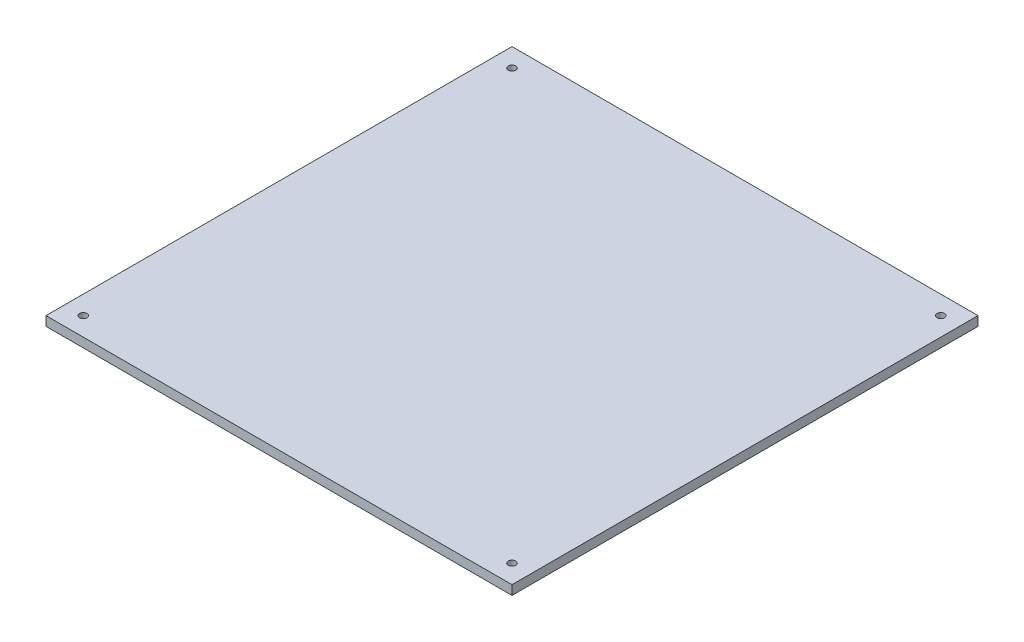
ISO-10303-21;
HEADER;
FILE_DESCRIPTION(('STEP AP214'),'2;1');
FILE_NAME('part.step','',(''),(''),'','','');
FILE_SCHEMA(('AUTOMOTIVE_DESIGN { 1 0 10303 214 1 1 1 1 }'));
ENDSEC;
DATA;
#1=APPLICATION_CONTEXT('core data for automotive mechanical design processes');
#2=APPLICATION_PROTOCOL_DEFINITION('international standard','automotive_design',2000,#1);
#3=PRODUCT_CONTEXT('',#1,'mechanical');
#4=PRODUCT('Part','Part','',(#3));
#5=PRODUCT_RELATED_PRODUCT_CATEGORY('part','',(#4));
#6=PRODUCT_DEFINITION_FORMATION('','',#4);
#7=PRODUCT_DEFINITION_CONTEXT('part definition',#1,'design');
#8=PRODUCT_DEFINITION('design','',#6,#7);
#9=PRODUCT_DEFINITION_SHAPE('','',#8);
#10=(LENGTH_UNIT() NAMED_UNIT(*) SI_UNIT(.MILLI.,.METRE.));
#11=(NAMED_UNIT(*) PLANE_ANGLE_UNIT() SI_UNIT($,.RADIAN.));
#12=(NAMED_UNIT(*) SI_UNIT($,.STERADIAN.) SOLID_ANGLE_UNIT());
#13=UNCERTAINTY_MEASURE_WITH_UNIT(LENGTH_MEASURE(1.E-05),#10,'distance_accuracy_value','');
#14=(GEOMETRIC_REPRESENTATION_CONTEXT(3) GLOBAL_UNCERTAINTY_ASSIGNED_CONTEXT((#13)) GLOBAL_UNIT_ASSIGNED_CONTEXT((#10,
#11,#12)) REPRESENTATION_CONTEXT('',''));
#15=CARTESIAN_POINT('',(0.,0.,0.));
#16=DIRECTION('',(0.,0.,1.));
#17=DIRECTION('',(1.,0.,0.));
#18=AXIS2_PLACEMENT_3D('',#15,#16,#17);
#19=CARTESIAN_POINT('',(250.,10.,250.));
#20=DIRECTION('',(-1.,0.,0.));
#21=DIRECTION('',(0.,0.,1.));
#22=AXIS2_PLACEMENT_3D('',#19,#20,#21);
#23=PLANE('',#22);
#24=DIRECTION('',(0.,0.,-1.));
#25=VECTOR('',#24,1.);
#26=CARTESIAN_POINT('',(250.,0.,250.));
#27=LINE('',#26,#25);
#28=CARTESIAN_POINT('',(250.,0.,250.));
#29=VERTEX_POINT('',#28);
#30=CARTESIAN_POINT('',(250.,0.,-250.));
#31=VERTEX_POINT('',#30);
#32=EDGE_CURVE('E107',#29,#31,#27,.T.);
#33=ORIENTED_EDGE('',*,*,#32,.T.);
#34=DIRECTION('',(0.,-1.,0.));
#35=VECTOR('',#34,1.);
#36=CARTESIAN_POINT('',(250.,10.,-250.));
#37=LINE('',#36,#35);
#38=CARTESIAN_POINT('',(250.,10.,-250.));
#39=VERTEX_POINT('',#38);
#40=EDGE_CURVE('E11',#39,#31,#37,.T.);
#41=ORIENTED_EDGE('',*,*,#40,.F.);
#42=DIRECTION('',(0.,0.,-1.));
#43=VECTOR('',#42,1.);
#44=CARTESIAN_POINT('',(250.,10.,250.));
#45=LINE('',#44,#43);
#46=CARTESIAN_POINT('',(250.,10.,250.));
#47=VERTEX_POINT('',#46);
#48=EDGE_CURVE('E91',#47,#39,#45,.T.);
#49=ORIENTED_EDGE('',*,*,#48,.F.);
#50=DIRECTION('',(0.,-1.,0.));
#51=VECTOR('',#50,1.);
#52=CARTESIAN_POINT('',(250.,10.,250.));
#53=LINE('',#52,#51);
#54=EDGE_CURVE('E103',#47,#29,#53,.T.);
#55=ORIENTED_EDGE('',*,*,#54,.T.);
#56=EDGE_LOOP('',(#33,#41,#49,#55));
#57=FACE_BOUND('',#56,.T.);
#58=ADVANCED_FACE('F39',(#57),#23,.F.);
#59=CARTESIAN_POINT('',(-250.,10.,-250.));
#60=DIRECTION('',(0.,0.,1.));
#61=DIRECTION('',(1.,0.,0.));
#62=AXIS2_PLACEMENT_3D('',#59,#60,#61);
#63=PLANE('',#62);
#64=DIRECTION('',(-1.,0.,0.));
#65=VECTOR('',#64,1.);
#66=CARTESIAN_POINT('',(-250.,0.,-250.));
#67=LINE('',#66,#65);
#68=CARTESIAN_POINT('',(-250.,0.,-250.));
#69=VERTEX_POINT('',#68);
#70=EDGE_CURVE('E96',#31,#69,#67,.T.);
#71=ORIENTED_EDGE('',*,*,#70,.T.);
#72=DIRECTION('',(0.,-1.,0.));
#73=VECTOR('',#72,1.);
#74=CARTESIAN_POINT('',(-250.,10.,-250.));
#75=LINE('',#74,#73);
#76=CARTESIAN_POINT('',(-250.,10.,-250.));
#77=VERTEX_POINT('',#76);
#78=EDGE_CURVE('E48',#77,#69,#75,.T.);
#79=ORIENTED_EDGE('',*,*,#78,.F.);
#80=DIRECTION('',(-1.,0.,0.));
#81=VECTOR('',#80,1.);
#82=CARTESIAN_POINT('',(-250.,10.,-250.));
#83=LINE('',#82,#81);
#84=EDGE_CURVE('E86',#39,#77,#83,.T.);
#85=ORIENTED_EDGE('',*,*,#84,.F.);
#86=ORIENTED_EDGE('',*,*,#40,.T.);
#87=EDGE_LOOP('',(#71,#79,#85,#86));
#88=FACE_BOUND('',#87,.T.);
#89=ADVANCED_FACE('F95',(#88),#63,.F.);
#90=CARTESIAN_POINT('',(-250.,10.,250.));
#91=DIRECTION('',(1.,0.,0.));
#92=DIRECTION('',(0.,0.,-1.));
#93=AXIS2_PLACEMENT_3D('',#90,#91,#92);
#94=PLANE('',#93);
#95=DIRECTION('',(0.,0.,1.));
#96=VECTOR('',#95,1.);
#97=CARTESIAN_POINT('',(-250.,0.,250.));
#98=LINE('',#97,#96);
#99=CARTESIAN_POINT('',(-250.,0.,250.));
#100=VERTEX_POINT('',#99);
#101=EDGE_CURVE('E73',#69,#100,#98,.T.);
#102=ORIENTED_EDGE('',*,*,#101,.T.);
#103=DIRECTION('',(0.,-1.,0.));
#104=VECTOR('',#103,1.);
#105=CARTESIAN_POINT('',(-250.,10.,250.));
#106=LINE('',#105,#104);
#107=CARTESIAN_POINT('',(-250.,10.,250.));
#108=VERTEX_POINT('',#107);
#109=EDGE_CURVE('E98',#108,#100,#106,.T.);
#110=ORIENTED_EDGE('',*,*,#109,.F.);
#111=DIRECTION('',(0.,0.,1.));
#112=VECTOR('',#111,1.);
#113=CARTESIAN_POINT('',(-250.,10.,250.));
#114=LINE('',#113,#112);
#115=EDGE_CURVE('E89',#77,#108,#114,.T.);
#116=ORIENTED_EDGE('',*,*,#115,.F.);
#117=ORIENTED_EDGE('',*,*,#78,.T.);
#118=EDGE_LOOP('',(#102,#110,#116,#117));
#119=FACE_BOUND('',#118,.T.);
#120=ADVANCED_FACE('F99',(#119),#94,.F.);
#121=CARTESIAN_POINT('',(-250.,10.,250.));
#122=DIRECTION('',(0.,0.,-1.));
#123=DIRECTION('',(-1.,0.,0.));
#124=AXIS2_PLACEMENT_3D('',#121,#122,#123);
#125=PLANE('',#124);
#126=DIRECTION('',(1.,0.,0.));
#127=VECTOR('',#126,1.);
#128=CARTESIAN_POINT('',(-250.,0.,250.));
#129=LINE('',#128,#127);
#130=EDGE_CURVE('E79',#100,#29,#129,.T.);
#131=ORIENTED_EDGE('',*,*,#130,.T.);
#132=ORIENTED_EDGE('',*,*,#54,.F.);
#133=DIRECTION('',(1.,0.,0.));
#134=VECTOR('',#133,1.);
#135=CARTESIAN_POINT('',(-250.,10.,250.));
#136=LINE('',#135,#134);
#137=EDGE_CURVE('E56',#108,#47,#136,.T.);
#138=ORIENTED_EDGE('',*,*,#137,.F.);
#139=ORIENTED_EDGE('',*,*,#109,.T.);
#140=EDGE_LOOP('',(#131,#132,#138,#139));
#141=FACE_BOUND('',#140,.T.);
#142=ADVANCED_FACE('F121',(#141),#125,.F.);
#143=CARTESIAN_POINT('',(0.,10.,0.));
#144=DIRECTION('',(0.,-1.,0.));
#145=DIRECTION('',(0.,0.,-1.));
#146=AXIS2_PLACEMENT_3D('',#143,#144,#145);
#147=PLANE('',#146);
#148=CARTESIAN_POINT('',(-230.,10.,230.));
#149=DIRECTION('',(0.,1.,0.));
#150=DIRECTION('',(0.,0.,1.));
#151=AXIS2_PLACEMENT_3D('',#148,#149,#150);
#152=CIRCLE('',#151,3.99999999999997);
#153=CARTESIAN_POINT('',(-230.,10.,234.));
#154=VERTEX_POINT('',#153);
#155=EDGE_CURVE('E136',#154,#154,#152,.T.);
#156=ORIENTED_EDGE('',*,*,#155,.F.);
#157=EDGE_LOOP('',(#156));
#158=FACE_BOUND('',#157,.T.);
#159=CARTESIAN_POINT('',(230.,10.,230.));
#160=DIRECTION('',(0.,1.,0.));
#161=DIRECTION('',(0.,0.,1.));
#162=AXIS2_PLACEMENT_3D('',#159,#160,#161);
#163=CIRCLE('',#162,3.99999999999997);
#164=CARTESIAN_POINT('',(230.,10.,234.));
#165=VERTEX_POINT('',#164);
#166=EDGE_CURVE('E144',#165,#165,#163,.T.);
#167=ORIENTED_EDGE('',*,*,#166,.F.);
#168=EDGE_LOOP('',(#167));
#169=FACE_BOUND('',#168,.T.);
#170=CARTESIAN_POINT('',(230.,10.,-230.));
#171=DIRECTION('',(0.,1.,0.));
#172=DIRECTION('',(0.,0.,1.));
#173=AXIS2_PLACEMENT_3D('',#170,#171,#172);
#174=CIRCLE('',#173,3.99999999999997);
#175=CARTESIAN_POINT('',(230.,10.,-226.));
#176=VERTEX_POINT('',#175);
#177=EDGE_CURVE('E152',#176,#176,#174,.T.);
#178=ORIENTED_EDGE('',*,*,#177,.F.);
#179=EDGE_LOOP('',(#178));
#180=FACE_BOUND('',#179,.T.);
#181=CARTESIAN_POINT('',(-230.,10.,-230.));
#182=DIRECTION('',(0.,1.,0.));
#183=DIRECTION('',(0.,0.,1.));
#184=AXIS2_PLACEMENT_3D('',#181,#182,#183);
#185=CIRCLE('',#184,3.99999999999999);
#186=CARTESIAN_POINT('',(-230.,10.,-226.));
#187=VERTEX_POINT('',#186);
#188=EDGE_CURVE('E128',#187,#187,#185,.T.);
#189=ORIENTED_EDGE('',*,*,#188,.F.);
#190=EDGE_LOOP('',(#189));
#191=FACE_BOUND('',#190,.T.);
#192=ORIENTED_EDGE('',*,*,#48,.T.);
#193=ORIENTED_EDGE('',*,*,#84,.T.);
#194=ORIENTED_EDGE('',*,*,#115,.T.);
#195=ORIENTED_EDGE('',*,*,#137,.T.);
#196=EDGE_LOOP('',(#192,#193,#194,#195));
#197=FACE_BOUND('',#196,.T.);
#198=ADVANCED_FACE('F87',(#158,#169,#180,#191,#197),#147,.F.);
#199=CARTESIAN_POINT('',(0.,0.,0.));
#200=DIRECTION('',(0.,-1.,0.));
#201=DIRECTION('',(0.,0.,-1.));
#202=AXIS2_PLACEMENT_3D('',#199,#200,#201);
#203=PLANE('',#202);
#204=CARTESIAN_POINT('',(-230.,0.,230.));
#205=DIRECTION('',(0.,1.,0.));
#206=DIRECTION('',(0.,0.,1.));
#207=AXIS2_PLACEMENT_3D('',#204,#205,#206);
#208=CIRCLE('',#207,3.99999999999997);
#209=CARTESIAN_POINT('',(-230.,0.,234.));
#210=VERTEX_POINT('',#209);
#211=EDGE_CURVE('E140',#210,#210,#208,.T.);
#212=ORIENTED_EDGE('',*,*,#211,.T.);
#213=EDGE_LOOP('',(#212));
#214=FACE_BOUND('',#213,.T.);
#215=CARTESIAN_POINT('',(230.,0.,230.));
#216=DIRECTION('',(0.,1.,0.));
#217=DIRECTION('',(0.,0.,1.));
#218=AXIS2_PLACEMENT_3D('',#215,#216,#217);
#219=CIRCLE('',#218,3.99999999999997);
#220=CARTESIAN_POINT('',(230.,0.,234.));
#221=VERTEX_POINT('',#220);
#222=EDGE_CURVE('E148',#221,#221,#219,.T.);
#223=ORIENTED_EDGE('',*,*,#222,.T.);
#224=EDGE_LOOP('',(#223));
#225=FACE_BOUND('',#224,.T.);
#226=CARTESIAN_POINT('',(230.,0.,-230.));
#227=DIRECTION('',(0.,1.,0.));
#228=DIRECTION('',(0.,0.,1.));
#229=AXIS2_PLACEMENT_3D('',#226,#227,#228);
#230=CIRCLE('',#229,3.99999999999997);
#231=CARTESIAN_POINT('',(230.,0.,-226.));
#232=VERTEX_POINT('',#231);
#233=EDGE_CURVE('E132',#232,#232,#230,.T.);
#234=ORIENTED_EDGE('',*,*,#233,.T.);
#235=EDGE_LOOP('',(#234));
#236=FACE_BOUND('',#235,.T.);
#237=CARTESIAN_POINT('',(-230.,0.,-230.));
#238=DIRECTION('',(0.,1.,0.));
#239=DIRECTION('',(0.,0.,1.));
#240=AXIS2_PLACEMENT_3D('',#237,#238,#239);
#241=CIRCLE('',#240,3.99999999999999);
#242=CARTESIAN_POINT('',(-230.,0.,-226.));
#243=VERTEX_POINT('',#242);
#244=EDGE_CURVE('E111',#243,#243,#241,.T.);
#245=ORIENTED_EDGE('',*,*,#244,.T.);
#246=EDGE_LOOP('',(#245));
#247=FACE_BOUND('',#246,.T.);
#248=ORIENTED_EDGE('',*,*,#32,.F.);
#249=ORIENTED_EDGE('',*,*,#130,.F.);
#250=ORIENTED_EDGE('',*,*,#101,.F.);
#251=ORIENTED_EDGE('',*,*,#70,.F.);
#252=EDGE_LOOP('',(#248,#249,#250,#251));
#253=FACE_BOUND('',#252,.T.);
#254=ADVANCED_FACE('F124',(#214,#225,#236,#247,#253),#203,.T.);
#255=CARTESIAN_POINT('',(-230.,0.,-230.));
#256=DIRECTION('',(0.,1.,0.));
#257=DIRECTION('',(0.,0.,1.));
#258=AXIS2_PLACEMENT_3D('',#255,#256,#257);
#259=CYLINDRICAL_SURFACE('',#258,3.99999999999999);
#260=ORIENTED_EDGE('',*,*,#244,.F.);
#261=EDGE_LOOP('',(#260));
#262=FACE_BOUND('',#261,.T.);
#263=ORIENTED_EDGE('',*,*,#188,.T.);
#264=EDGE_LOOP('',(#263));
#265=FACE_BOUND('',#264,.T.);
#266=ADVANCED_FACE('F166',(#262,#265),#259,.F.);
#267=CARTESIAN_POINT('',(230.,0.,-230.));
#268=DIRECTION('',(0.,1.,0.));
#269=DIRECTION('',(0.,0.,1.));
#270=AXIS2_PLACEMENT_3D('',#267,#268,#269);
#271=CYLINDRICAL_SURFACE('',#270,3.99999999999997);
#272=ORIENTED_EDGE('',*,*,#233,.F.);
#273=EDGE_LOOP('',(#272));
#274=FACE_BOUND('',#273,.T.);
#275=ORIENTED_EDGE('',*,*,#177,.T.);
#276=EDGE_LOOP('',(#275));
#277=FACE_BOUND('',#276,.T.);
#278=ADVANCED_FACE('F162',(#274,#277),#271,.F.);
#279=CARTESIAN_POINT('',(230.,0.,230.));
#280=DIRECTION('',(0.,1.,0.));
#281=DIRECTION('',(0.,0.,1.));
#282=AXIS2_PLACEMENT_3D('',#279,#280,#281);
#283=CYLINDRICAL_SURFACE('',#282,3.99999999999997);
#284=ORIENTED_EDGE('',*,*,#222,.F.);
#285=EDGE_LOOP('',(#284));
#286=FACE_BOUND('',#285,.T.);
#287=ORIENTED_EDGE('',*,*,#166,.T.);
#288=EDGE_LOOP('',(#287));
#289=FACE_BOUND('',#288,.T.);
#290=ADVANCED_FACE('F165',(#286,#289),#283,.F.);
#291=CARTESIAN_POINT('',(-230.,0.,230.));
#292=DIRECTION('',(0.,1.,0.));
#293=DIRECTION('',(0.,0.,1.));
#294=AXIS2_PLACEMENT_3D('',#291,#292,#293);
#295=CYLINDRICAL_SURFACE('',#294,3.99999999999997);
#296=ORIENTED_EDGE('',*,*,#211,.F.);
#297=EDGE_LOOP('',(#296));
#298=FACE_BOUND('',#297,.T.);
#299=ORIENTED_EDGE('',*,*,#155,.T.);
#300=EDGE_LOOP('',(#299));
#301=FACE_BOUND('',#300,.T.);
#302=ADVANCED_FACE('F227',(#298,#301),#295,.F.);
#303=CLOSED_SHELL('',(#58,#89,#120,#142,#198,#254,#266,#278,#290,#302));
#304=MANIFOLD_SOLID_BREP('B2',#303);
#305=ADVANCED_BREP_SHAPE_REPRESENTATION('',(#18,#304),#14);
#306=SHAPE_DEFINITION_REPRESENTATION(#9,#305);
ENDSEC;
END-ISO-10303-21;
